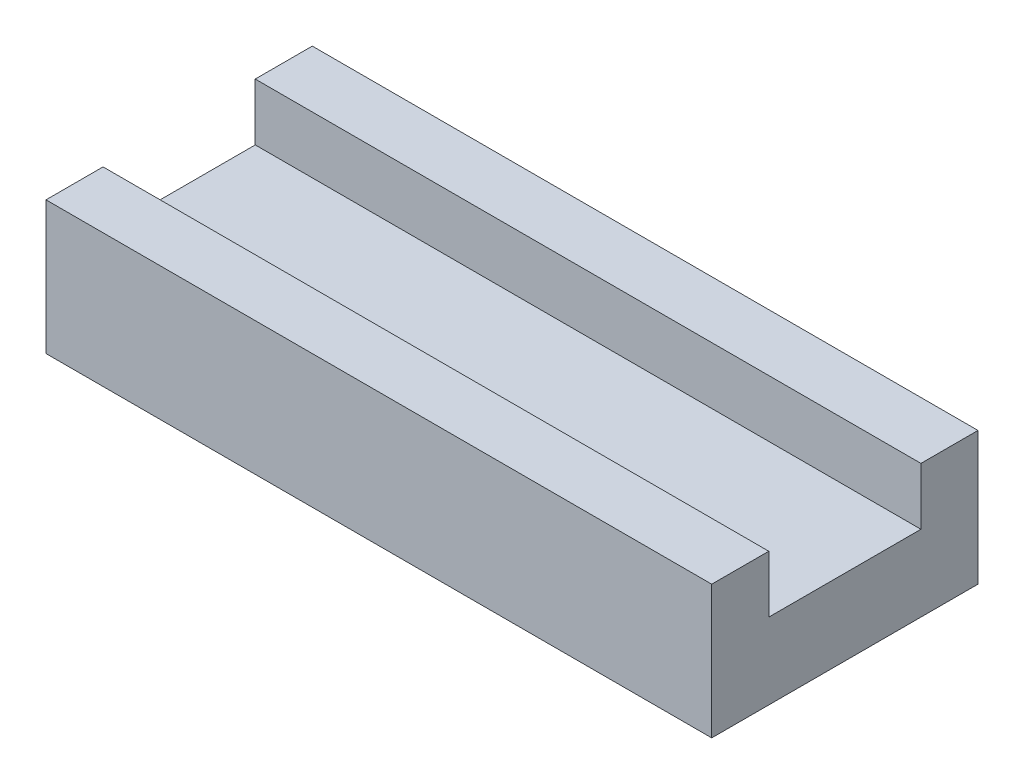
ISO-10303-21;
HEADER;
FILE_DESCRIPTION(('STEP AP214'),'2;1');
FILE_NAME('part.step','',(''),(''),'','','');
FILE_SCHEMA(('AUTOMOTIVE_DESIGN { 1 0 10303 214 1 1 1 1 }'));
ENDSEC;
DATA;
#1=APPLICATION_CONTEXT('core data for automotive mechanical design processes');
#2=APPLICATION_PROTOCOL_DEFINITION('international standard','automotive_design',2000,#1);
#3=PRODUCT_CONTEXT('',#1,'mechanical');
#4=PRODUCT('Part','Part','',(#3));
#5=PRODUCT_RELATED_PRODUCT_CATEGORY('part','',(#4));
#6=PRODUCT_DEFINITION_FORMATION('','',#4);
#7=PRODUCT_DEFINITION_CONTEXT('part definition',#1,'design');
#8=PRODUCT_DEFINITION('design','',#6,#7);
#9=PRODUCT_DEFINITION_SHAPE('','',#8);
#10=(LENGTH_UNIT() NAMED_UNIT(*) SI_UNIT(.MILLI.,.METRE.));
#11=(NAMED_UNIT(*) PLANE_ANGLE_UNIT() SI_UNIT($,.RADIAN.));
#12=(NAMED_UNIT(*) SI_UNIT($,.STERADIAN.) SOLID_ANGLE_UNIT());
#13=UNCERTAINTY_MEASURE_WITH_UNIT(LENGTH_MEASURE(1.E-05),#10,'distance_accuracy_value','');
#14=(GEOMETRIC_REPRESENTATION_CONTEXT(3) GLOBAL_UNCERTAINTY_ASSIGNED_CONTEXT((#13)) GLOBAL_UNIT_ASSIGNED_CONTEXT((#10,
#11,#12)) REPRESENTATION_CONTEXT('',''));
#15=CARTESIAN_POINT('',(0.,0.,0.));
#16=DIRECTION('',(0.,0.,1.));
#17=DIRECTION('',(1.,0.,0.));
#18=AXIS2_PLACEMENT_3D('',#15,#16,#17);
#19=CARTESIAN_POINT('',(-35.,-2.,-7.));
#20=DIRECTION('',(0.,0.,-1.));
#21=DIRECTION('',(0.,1.,0.));
#22=AXIS2_PLACEMENT_3D('',#19,#20,#21);
#23=PLANE('',#22);
#24=DIRECTION('',(0.,1.,0.));
#25=VECTOR('',#24,1.);
#26=CARTESIAN_POINT('',(0.,-2.,-7.));
#27=LINE('',#26,#25);
#28=CARTESIAN_POINT('',(0.,-2.,-7.));
#29=VERTEX_POINT('',#28);
#30=CARTESIAN_POINT('',(0.,5.,-7.));
#31=VERTEX_POINT('',#30);
#32=EDGE_CURVE('E153',#29,#31,#27,.T.);
#33=ORIENTED_EDGE('',*,*,#32,.F.);
#34=DIRECTION('',(1.,0.,0.));
#35=VECTOR('',#34,1.);
#36=CARTESIAN_POINT('',(-35.,-2.,-7.));
#37=LINE('',#36,#35);
#38=CARTESIAN_POINT('',(-35.,-2.,-7.));
#39=VERTEX_POINT('',#38);
#40=EDGE_CURVE('E11',#39,#29,#37,.T.);
#41=ORIENTED_EDGE('',*,*,#40,.F.);
#42=DIRECTION('',(0.,1.,0.));
#43=VECTOR('',#42,1.);
#44=CARTESIAN_POINT('',(-35.,2.,-7.));
#45=LINE('',#44,#43);
#46=CARTESIAN_POINT('',(-35.,5.,-7.));
#47=VERTEX_POINT('',#46);
#48=EDGE_CURVE('E56',#39,#47,#45,.T.);
#49=ORIENTED_EDGE('',*,*,#48,.T.);
#50=DIRECTION('',(1.,0.,0.));
#51=VECTOR('',#50,1.);
#52=CARTESIAN_POINT('',(-35.,5.,-7.));
#53=LINE('',#52,#51);
#54=EDGE_CURVE('E41',#47,#31,#53,.T.);
#55=ORIENTED_EDGE('',*,*,#54,.T.);
#56=EDGE_LOOP('',(#33,#41,#49,#55));
#57=FACE_BOUND('',#56,.T.);
#58=ADVANCED_FACE('F37',(#57),#23,.T.);
#59=CARTESIAN_POINT('',(-35.,-2.,7.));
#60=DIRECTION('',(0.,-1.,0.));
#61=DIRECTION('',(0.,0.,-1.));
#62=AXIS2_PLACEMENT_3D('',#59,#60,#61);
#63=PLANE('',#62);
#64=DIRECTION('',(0.,0.,-1.));
#65=VECTOR('',#64,1.);
#66=CARTESIAN_POINT('',(0.,-2.,7.));
#67=LINE('',#66,#65);
#68=CARTESIAN_POINT('',(0.,-2.,7.));
#69=VERTEX_POINT('',#68);
#70=EDGE_CURVE('E151',#69,#29,#67,.T.);
#71=ORIENTED_EDGE('',*,*,#70,.F.);
#72=DIRECTION('',(1.,0.,0.));
#73=VECTOR('',#72,1.);
#74=CARTESIAN_POINT('',(-35.,-2.,7.));
#75=LINE('',#74,#73);
#76=CARTESIAN_POINT('',(-35.,-2.,7.));
#77=VERTEX_POINT('',#76);
#78=EDGE_CURVE('E47',#77,#69,#75,.T.);
#79=ORIENTED_EDGE('',*,*,#78,.F.);
#80=DIRECTION('',(0.,0.,-1.));
#81=VECTOR('',#80,1.);
#82=CARTESIAN_POINT('',(-35.,-2.,7.));
#83=LINE('',#82,#81);
#84=EDGE_CURVE('E126',#77,#39,#83,.T.);
#85=ORIENTED_EDGE('',*,*,#84,.T.);
#86=ORIENTED_EDGE('',*,*,#40,.T.);
#87=EDGE_LOOP('',(#71,#79,#85,#86));
#88=FACE_BOUND('',#87,.T.);
#89=ADVANCED_FACE('F166',(#88),#63,.T.);
#90=CARTESIAN_POINT('',(-35.,-2.,7.));
#91=DIRECTION('',(0.,0.,1.));
#92=DIRECTION('',(0.,-1.,0.));
#93=AXIS2_PLACEMENT_3D('',#90,#91,#92);
#94=PLANE('',#93);
#95=DIRECTION('',(0.,-1.,0.));
#96=VECTOR('',#95,1.);
#97=CARTESIAN_POINT('',(0.,-2.,7.));
#98=LINE('',#97,#96);
#99=CARTESIAN_POINT('',(0.,5.,7.));
#100=VERTEX_POINT('',#99);
#101=EDGE_CURVE('E114',#100,#69,#98,.T.);
#102=ORIENTED_EDGE('',*,*,#101,.F.);
#103=DIRECTION('',(1.,0.,0.));
#104=VECTOR('',#103,1.);
#105=CARTESIAN_POINT('',(-35.,5.,7.));
#106=LINE('',#105,#104);
#107=CARTESIAN_POINT('',(-35.,5.,7.));
#108=VERTEX_POINT('',#107);
#109=EDGE_CURVE('E109',#108,#100,#106,.T.);
#110=ORIENTED_EDGE('',*,*,#109,.F.);
#111=DIRECTION('',(0.,-1.,0.));
#112=VECTOR('',#111,1.);
#113=CARTESIAN_POINT('',(-35.,2.,7.));
#114=LINE('',#113,#112);
#115=EDGE_CURVE('E112',#108,#77,#114,.T.);
#116=ORIENTED_EDGE('',*,*,#115,.T.);
#117=ORIENTED_EDGE('',*,*,#78,.T.);
#118=EDGE_LOOP('',(#102,#110,#116,#117));
#119=FACE_BOUND('',#118,.T.);
#120=ADVANCED_FACE('F111',(#119),#94,.T.);
#121=CARTESIAN_POINT('',(-35.,5.,7.));
#122=DIRECTION('',(0.,1.,0.));
#123=DIRECTION('',(0.,0.,1.));
#124=AXIS2_PLACEMENT_3D('',#121,#122,#123);
#125=PLANE('',#124);
#126=DIRECTION('',(0.,0.,1.));
#127=VECTOR('',#126,1.);
#128=CARTESIAN_POINT('',(0.,5.,7.));
#129=LINE('',#128,#127);
#130=CARTESIAN_POINT('',(0.,5.,4.));
#131=VERTEX_POINT('',#130);
#132=EDGE_CURVE('E148',#131,#100,#129,.T.);
#133=ORIENTED_EDGE('',*,*,#132,.F.);
#134=DIRECTION('',(1.,0.,0.));
#135=VECTOR('',#134,1.);
#136=CARTESIAN_POINT('',(-35.,5.,4.));
#137=LINE('',#136,#135);
#138=CARTESIAN_POINT('',(-35.,5.,4.));
#139=VERTEX_POINT('',#138);
#140=EDGE_CURVE('E119',#139,#131,#137,.T.);
#141=ORIENTED_EDGE('',*,*,#140,.F.);
#142=DIRECTION('',(0.,0.,1.));
#143=VECTOR('',#142,1.);
#144=CARTESIAN_POINT('',(-35.,5.,7.));
#145=LINE('',#144,#143);
#146=EDGE_CURVE('E124',#139,#108,#145,.T.);
#147=ORIENTED_EDGE('',*,*,#146,.T.);
#148=ORIENTED_EDGE('',*,*,#109,.T.);
#149=EDGE_LOOP('',(#133,#141,#147,#148));
#150=FACE_BOUND('',#149,.T.);
#151=ADVANCED_FACE('F128',(#150),#125,.T.);
#152=CARTESIAN_POINT('',(-35.,5.,4.));
#153=DIRECTION('',(0.,0.,-1.));
#154=DIRECTION('',(0.,1.,0.));
#155=AXIS2_PLACEMENT_3D('',#152,#153,#154);
#156=PLANE('',#155);
#157=DIRECTION('',(0.,1.,0.));
#158=VECTOR('',#157,1.);
#159=CARTESIAN_POINT('',(0.,5.,4.));
#160=LINE('',#159,#158);
#161=CARTESIAN_POINT('',(0.,2.,4.));
#162=VERTEX_POINT('',#161);
#163=EDGE_CURVE('E145',#162,#131,#160,.T.);
#164=ORIENTED_EDGE('',*,*,#163,.F.);
#165=DIRECTION('',(1.,0.,0.));
#166=VECTOR('',#165,1.);
#167=CARTESIAN_POINT('',(-35.,2.,4.));
#168=LINE('',#167,#166);
#169=CARTESIAN_POINT('',(-35.,2.,4.));
#170=VERTEX_POINT('',#169);
#171=EDGE_CURVE('E157',#170,#162,#168,.T.);
#172=ORIENTED_EDGE('',*,*,#171,.F.);
#173=DIRECTION('',(0.,1.,0.));
#174=VECTOR('',#173,1.);
#175=CARTESIAN_POINT('',(-35.,5.,4.));
#176=LINE('',#175,#174);
#177=EDGE_CURVE('E129',#170,#139,#176,.T.);
#178=ORIENTED_EDGE('',*,*,#177,.T.);
#179=ORIENTED_EDGE('',*,*,#140,.T.);
#180=EDGE_LOOP('',(#164,#172,#178,#179));
#181=FACE_BOUND('',#180,.T.);
#182=ADVANCED_FACE('F179',(#181),#156,.T.);
#183=CARTESIAN_POINT('',(-35.,2.,4.));
#184=DIRECTION('',(0.,1.,0.));
#185=DIRECTION('',(0.,0.,1.));
#186=AXIS2_PLACEMENT_3D('',#183,#184,#185);
#187=PLANE('',#186);
#188=DIRECTION('',(0.,0.,1.));
#189=VECTOR('',#188,1.);
#190=CARTESIAN_POINT('',(0.,2.,4.));
#191=LINE('',#190,#189);
#192=CARTESIAN_POINT('',(0.,2.,-4.));
#193=VERTEX_POINT('',#192);
#194=EDGE_CURVE('E142',#193,#162,#191,.T.);
#195=ORIENTED_EDGE('',*,*,#194,.F.);
#196=DIRECTION('',(1.,0.,0.));
#197=VECTOR('',#196,1.);
#198=CARTESIAN_POINT('',(-35.,2.,-4.));
#199=LINE('',#198,#197);
#200=CARTESIAN_POINT('',(-35.,2.,-4.));
#201=VERTEX_POINT('',#200);
#202=EDGE_CURVE('E159',#201,#193,#199,.T.);
#203=ORIENTED_EDGE('',*,*,#202,.F.);
#204=DIRECTION('',(0.,0.,1.));
#205=VECTOR('',#204,1.);
#206=CARTESIAN_POINT('',(-35.,2.,4.));
#207=LINE('',#206,#205);
#208=EDGE_CURVE('E131',#201,#170,#207,.T.);
#209=ORIENTED_EDGE('',*,*,#208,.T.);
#210=ORIENTED_EDGE('',*,*,#171,.T.);
#211=EDGE_LOOP('',(#195,#203,#209,#210));
#212=FACE_BOUND('',#211,.T.);
#213=ADVANCED_FACE('F182',(#212),#187,.T.);
#214=CARTESIAN_POINT('',(-35.,5.,-4.));
#215=DIRECTION('',(0.,0.,1.));
#216=DIRECTION('',(0.,-1.,0.));
#217=AXIS2_PLACEMENT_3D('',#214,#215,#216);
#218=PLANE('',#217);
#219=DIRECTION('',(0.,-1.,0.));
#220=VECTOR('',#219,1.);
#221=CARTESIAN_POINT('',(0.,5.,-4.));
#222=LINE('',#221,#220);
#223=CARTESIAN_POINT('',(0.,5.,-4.));
#224=VERTEX_POINT('',#223);
#225=EDGE_CURVE('E139',#224,#193,#222,.T.);
#226=ORIENTED_EDGE('',*,*,#225,.F.);
#227=DIRECTION('',(1.,0.,0.));
#228=VECTOR('',#227,1.);
#229=CARTESIAN_POINT('',(-35.,5.,-4.));
#230=LINE('',#229,#228);
#231=CARTESIAN_POINT('',(-35.,5.,-4.));
#232=VERTEX_POINT('',#231);
#233=EDGE_CURVE('E160',#232,#224,#230,.T.);
#234=ORIENTED_EDGE('',*,*,#233,.F.);
#235=DIRECTION('',(0.,-1.,0.));
#236=VECTOR('',#235,1.);
#237=CARTESIAN_POINT('',(-35.,5.,-4.));
#238=LINE('',#237,#236);
#239=EDGE_CURVE('E195',#232,#201,#238,.T.);
#240=ORIENTED_EDGE('',*,*,#239,.T.);
#241=ORIENTED_EDGE('',*,*,#202,.T.);
#242=EDGE_LOOP('',(#226,#234,#240,#241));
#243=FACE_BOUND('',#242,.T.);
#244=ADVANCED_FACE('F185',(#243),#218,.T.);
#245=CARTESIAN_POINT('',(-35.,5.,-7.));
#246=DIRECTION('',(0.,1.,0.));
#247=DIRECTION('',(0.,0.,1.));
#248=AXIS2_PLACEMENT_3D('',#245,#246,#247);
#249=PLANE('',#248);
#250=DIRECTION('',(0.,0.,1.));
#251=VECTOR('',#250,1.);
#252=CARTESIAN_POINT('',(0.,5.,-7.));
#253=LINE('',#252,#251);
#254=EDGE_CURVE('E136',#31,#224,#253,.T.);
#255=ORIENTED_EDGE('',*,*,#254,.F.);
#256=ORIENTED_EDGE('',*,*,#54,.F.);
#257=DIRECTION('',(0.,0.,1.));
#258=VECTOR('',#257,1.);
#259=CARTESIAN_POINT('',(-35.,5.,-7.));
#260=LINE('',#259,#258);
#261=EDGE_CURVE('E199',#47,#232,#260,.T.);
#262=ORIENTED_EDGE('',*,*,#261,.T.);
#263=ORIENTED_EDGE('',*,*,#233,.T.);
#264=EDGE_LOOP('',(#255,#256,#262,#263));
#265=FACE_BOUND('',#264,.T.);
#266=ADVANCED_FACE('F39',(#265),#249,.T.);
#267=CARTESIAN_POINT('',(-35.,0.,0.));
#268=DIRECTION('',(1.,0.,0.));
#269=DIRECTION('',(0.,0.,-1.));
#270=AXIS2_PLACEMENT_3D('',#267,#268,#269);
#271=PLANE('',#270);
#272=ORIENTED_EDGE('',*,*,#48,.F.);
#273=ORIENTED_EDGE('',*,*,#84,.F.);
#274=ORIENTED_EDGE('',*,*,#115,.F.);
#275=ORIENTED_EDGE('',*,*,#146,.F.);
#276=ORIENTED_EDGE('',*,*,#177,.F.);
#277=ORIENTED_EDGE('',*,*,#208,.F.);
#278=ORIENTED_EDGE('',*,*,#239,.F.);
#279=ORIENTED_EDGE('',*,*,#261,.F.);
#280=EDGE_LOOP('',(#272,#273,#274,#275,#276,#277,#278,#279));
#281=FACE_BOUND('',#280,.T.);
#282=ADVANCED_FACE('F122',(#281),#271,.F.);
#283=CARTESIAN_POINT('',(0.,0.,0.));
#284=DIRECTION('',(1.,0.,0.));
#285=DIRECTION('',(0.,0.,-1.));
#286=AXIS2_PLACEMENT_3D('',#283,#284,#285);
#287=PLANE('',#286);
#288=ORIENTED_EDGE('',*,*,#32,.T.);
#289=ORIENTED_EDGE('',*,*,#254,.T.);
#290=ORIENTED_EDGE('',*,*,#225,.T.);
#291=ORIENTED_EDGE('',*,*,#194,.T.);
#292=ORIENTED_EDGE('',*,*,#163,.T.);
#293=ORIENTED_EDGE('',*,*,#132,.T.);
#294=ORIENTED_EDGE('',*,*,#101,.T.);
#295=ORIENTED_EDGE('',*,*,#70,.T.);
#296=EDGE_LOOP('',(#288,#289,#290,#291,#292,#293,#294,#295));
#297=FACE_BOUND('',#296,.T.);
#298=ADVANCED_FACE('F165',(#297),#287,.T.);
#299=CLOSED_SHELL('',(#58,#89,#120,#151,#182,#213,#244,#266,#282,#298));
#300=MANIFOLD_SOLID_BREP('B2',#299);
#301=ADVANCED_BREP_SHAPE_REPRESENTATION('',(#18,#300),#14);
#302=SHAPE_DEFINITION_REPRESENTATION(#9,#301);
ENDSEC;
END-ISO-10303-21;
